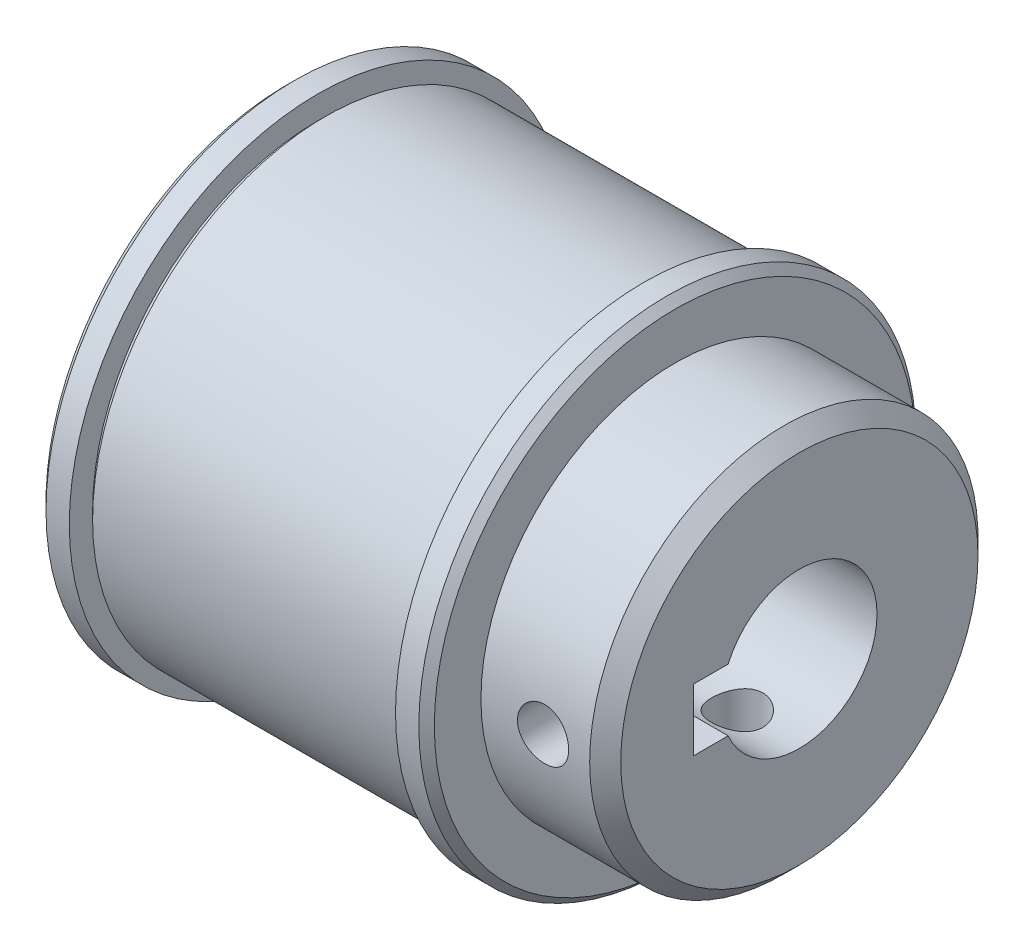
ISO-10303-21;
HEADER;
FILE_DESCRIPTION(('STEP AP214'),'2;1');
FILE_NAME('part.step','',(''),(''),'','','');
FILE_SCHEMA(('AUTOMOTIVE_DESIGN { 1 0 10303 214 1 1 1 1 }'));
ENDSEC;
DATA;
#1=APPLICATION_CONTEXT('core data for automotive mechanical design processes');
#2=APPLICATION_PROTOCOL_DEFINITION('international standard','automotive_design',2000,#1);
#3=PRODUCT_CONTEXT('',#1,'mechanical');
#4=PRODUCT('Part','Part','',(#3));
#5=PRODUCT_RELATED_PRODUCT_CATEGORY('part','',(#4));
#6=PRODUCT_DEFINITION_FORMATION('','',#4);
#7=PRODUCT_DEFINITION_CONTEXT('part definition',#1,'design');
#8=PRODUCT_DEFINITION('design','',#6,#7);
#9=PRODUCT_DEFINITION_SHAPE('','',#8);
#10=(LENGTH_UNIT() NAMED_UNIT(*) SI_UNIT(.MILLI.,.METRE.));
#11=(NAMED_UNIT(*) PLANE_ANGLE_UNIT() SI_UNIT($,.RADIAN.));
#12=(NAMED_UNIT(*) SI_UNIT($,.STERADIAN.) SOLID_ANGLE_UNIT());
#13=UNCERTAINTY_MEASURE_WITH_UNIT(LENGTH_MEASURE(1.E-05),#10,'distance_accuracy_value','');
#14=(GEOMETRIC_REPRESENTATION_CONTEXT(3) GLOBAL_UNCERTAINTY_ASSIGNED_CONTEXT((#13)) GLOBAL_UNIT_ASSIGNED_CONTEXT((#10,
#11,#12)) REPRESENTATION_CONTEXT('',''));
#15=CARTESIAN_POINT('',(0.,0.,0.));
#16=DIRECTION('',(0.,0.,1.));
#17=DIRECTION('',(1.,0.,0.));
#18=AXIS2_PLACEMENT_3D('',#15,#16,#17);
#19=CARTESIAN_POINT('',(0.,0.,0.));
#20=DIRECTION('',(1.,0.,0.));
#21=DIRECTION('',(0.,0.,-1.));
#22=AXIS2_PLACEMENT_3D('',#19,#20,#21);
#23=PLANE('',#22);
#24=CARTESIAN_POINT('',(0.,0.,0.));
#25=DIRECTION('',(1.,0.,0.));
#26=DIRECTION('',(0.,0.,-1.));
#27=AXIS2_PLACEMENT_3D('',#24,#25,#26);
#28=CIRCLE('',#27,15.5);
#29=CARTESIAN_POINT('',(0.,0.,-15.5));
#30=VERTEX_POINT('',#29);
#31=EDGE_CURVE('E134',#30,#30,#28,.F.);
#32=ORIENTED_EDGE('',*,*,#31,.T.);
#33=EDGE_LOOP('',(#32));
#34=FACE_BOUND('',#33,.T.);
#35=CARTESIAN_POINT('',(0.,0.,0.));
#36=DIRECTION('',(-1.,0.,0.));
#37=DIRECTION('',(0.,0.,1.));
#38=AXIS2_PLACEMENT_3D('',#35,#36,#37);
#39=CIRCLE('',#38,5.);
#40=CARTESIAN_POINT('',(0.,2.,4.58257569495584));
#41=VERTEX_POINT('',#40);
#42=CARTESIAN_POINT('',(0.,-2.,4.58257569495584));
#43=VERTEX_POINT('',#42);
#44=EDGE_CURVE('E90',#41,#43,#39,.T.);
#45=ORIENTED_EDGE('',*,*,#44,.F.);
#46=DIRECTION('',(0.,0.,1.));
#47=VECTOR('',#46,1.);
#48=CARTESIAN_POINT('',(0.,2.,6.8));
#49=LINE('',#48,#47);
#50=CARTESIAN_POINT('',(0.,2.,6.8));
#51=VERTEX_POINT('',#50);
#52=EDGE_CURVE('E92',#41,#51,#49,.T.);
#53=ORIENTED_EDGE('',*,*,#52,.T.);
#54=DIRECTION('',(0.,-1.,0.));
#55=VECTOR('',#54,1.);
#56=CARTESIAN_POINT('',(0.,2.,6.8));
#57=LINE('',#56,#55);
#58=CARTESIAN_POINT('',(0.,-2.,6.8));
#59=VERTEX_POINT('',#58);
#60=EDGE_CURVE('E91',#51,#59,#57,.T.);
#61=ORIENTED_EDGE('',*,*,#60,.T.);
#62=DIRECTION('',(0.,0.,-1.));
#63=VECTOR('',#62,1.);
#64=CARTESIAN_POINT('',(0.,-2.,6.8));
#65=LINE('',#64,#63);
#66=EDGE_CURVE('E79',#59,#43,#65,.T.);
#67=ORIENTED_EDGE('',*,*,#66,.T.);
#68=EDGE_LOOP('',(#45,#53,#61,#67));
#69=FACE_BOUND('',#68,.T.);
#70=ADVANCED_FACE('F34',(#34,#69),#23,.F.);
#71=CARTESIAN_POINT('',(33.,12.5,0.));
#72=DIRECTION('',(-1.,0.,0.));
#73=DIRECTION('',(0.,0.,1.));
#74=AXIS2_PLACEMENT_3D('',#71,#72,#73);
#75=PLANE('',#74);
#76=CARTESIAN_POINT('',(33.,0.,0.));
#77=DIRECTION('',(-1.,0.,0.));
#78=DIRECTION('',(0.,0.,1.));
#79=AXIS2_PLACEMENT_3D('',#76,#77,#78);
#80=CIRCLE('',#79,11.5);
#81=CARTESIAN_POINT('',(33.,0.,11.5));
#82=VERTEX_POINT('',#81);
#83=EDGE_CURVE('E131',#82,#82,#80,.F.);
#84=ORIENTED_EDGE('',*,*,#83,.T.);
#85=EDGE_LOOP('',(#84));
#86=FACE_BOUND('',#85,.T.);
#87=DIRECTION('',(0.,-1.,0.));
#88=VECTOR('',#87,1.);
#89=CARTESIAN_POINT('',(33.,2.,6.8));
#90=LINE('',#89,#88);
#91=CARTESIAN_POINT('',(33.,2.,6.8));
#92=VERTEX_POINT('',#91);
#93=CARTESIAN_POINT('',(33.,-2.,6.8));
#94=VERTEX_POINT('',#93);
#95=EDGE_CURVE('E346',#92,#94,#90,.T.);
#96=ORIENTED_EDGE('',*,*,#95,.F.);
#97=DIRECTION('',(0.,0.,1.));
#98=VECTOR('',#97,1.);
#99=CARTESIAN_POINT('',(33.,2.,6.8));
#100=LINE('',#99,#98);
#101=CARTESIAN_POINT('',(33.,2.,4.58257569495584));
#102=VERTEX_POINT('',#101);
#103=EDGE_CURVE('E349',#102,#92,#100,.T.);
#104=ORIENTED_EDGE('',*,*,#103,.F.);
#105=CARTESIAN_POINT('',(33.,0.,0.));
#106=DIRECTION('',(-1.,0.,0.));
#107=DIRECTION('',(0.,0.,1.));
#108=AXIS2_PLACEMENT_3D('',#105,#106,#107);
#109=CIRCLE('',#108,5.);
#110=CARTESIAN_POINT('',(33.,-2.,4.58257569495584));
#111=VERTEX_POINT('',#110);
#112=EDGE_CURVE('E97',#102,#111,#109,.T.);
#113=ORIENTED_EDGE('',*,*,#112,.T.);
#114=DIRECTION('',(0.,0.,-1.));
#115=VECTOR('',#114,1.);
#116=CARTESIAN_POINT('',(33.,-2.,6.8));
#117=LINE('',#116,#115);
#118=EDGE_CURVE('E49',#94,#111,#117,.T.);
#119=ORIENTED_EDGE('',*,*,#118,.F.);
#120=EDGE_LOOP('',(#96,#104,#113,#119));
#121=FACE_BOUND('',#120,.T.);
#122=ADVANCED_FACE('F155',(#86,#121),#75,.F.);
#123=CARTESIAN_POINT('',(-28.0531916649474,0.,0.));
#124=DIRECTION('',(-1.,0.,0.));
#125=DIRECTION('',(0.,0.,1.));
#126=AXIS2_PLACEMENT_3D('',#123,#124,#125);
#127=CYLINDRICAL_SURFACE('',#126,16.);
#128=CARTESIAN_POINT('',(0.500000000000014,0.,0.));
#129=DIRECTION('',(1.,0.,0.));
#130=DIRECTION('',(0.,0.,-1.));
#131=AXIS2_PLACEMENT_3D('',#128,#129,#130);
#132=CIRCLE('',#131,16.);
#133=CARTESIAN_POINT('',(0.500000000000014,0.,-16.));
#134=VERTEX_POINT('',#133);
#135=EDGE_CURVE('E137',#134,#134,#132,.T.);
#136=ORIENTED_EDGE('',*,*,#135,.T.);
#137=EDGE_LOOP('',(#136));
#138=FACE_BOUND('',#137,.T.);
#139=CARTESIAN_POINT('',(2.,0.,0.));
#140=DIRECTION('',(-1.,0.,0.));
#141=DIRECTION('',(0.,0.,1.));
#142=AXIS2_PLACEMENT_3D('',#139,#140,#141);
#143=CIRCLE('',#142,16.);
#144=CARTESIAN_POINT('',(2.,0.,16.));
#145=VERTEX_POINT('',#144);
#146=EDGE_CURVE('E125',#145,#145,#143,.T.);
#147=ORIENTED_EDGE('',*,*,#146,.T.);
#148=EDGE_LOOP('',(#147));
#149=FACE_BOUND('',#148,.T.);
#150=ADVANCED_FACE('F161',(#138,#149),#127,.T.);
#151=CARTESIAN_POINT('',(2.,16.,0.));
#152=DIRECTION('',(-1.,0.,0.));
#153=DIRECTION('',(0.,0.,1.));
#154=AXIS2_PLACEMENT_3D('',#151,#152,#153);
#155=PLANE('',#154);
#156=ORIENTED_EDGE('',*,*,#146,.F.);
#157=EDGE_LOOP('',(#156));
#158=FACE_BOUND('',#157,.T.);
#159=CARTESIAN_POINT('',(2.,0.,0.));
#160=DIRECTION('',(-1.,0.,0.));
#161=DIRECTION('',(0.,0.,1.));
#162=AXIS2_PLACEMENT_3D('',#159,#160,#161);
#163=CIRCLE('',#162,14.5);
#164=CARTESIAN_POINT('',(2.,0.,14.5));
#165=VERTEX_POINT('',#164);
#166=EDGE_CURVE('E122',#165,#165,#163,.T.);
#167=ORIENTED_EDGE('',*,*,#166,.T.);
#168=EDGE_LOOP('',(#167));
#169=FACE_BOUND('',#168,.T.);
#170=ADVANCED_FACE('F226',(#158,#169),#155,.F.);
#171=CARTESIAN_POINT('',(-28.0531916649474,0.,0.));
#172=DIRECTION('',(-1.,0.,0.));
#173=DIRECTION('',(0.,0.,1.));
#174=AXIS2_PLACEMENT_3D('',#171,#172,#173);
#175=CYLINDRICAL_SURFACE('',#174,14.5);
#176=ORIENTED_EDGE('',*,*,#166,.F.);
#177=EDGE_LOOP('',(#176));
#178=FACE_BOUND('',#177,.T.);
#179=CARTESIAN_POINT('',(2.5,0.,0.));
#180=DIRECTION('',(-1.,0.,0.));
#181=DIRECTION('',(0.,0.,1.));
#182=AXIS2_PLACEMENT_3D('',#179,#180,#181);
#183=CIRCLE('',#182,14.5);
#184=CARTESIAN_POINT('',(2.5,0.,14.5));
#185=VERTEX_POINT('',#184);
#186=EDGE_CURVE('E119',#185,#185,#183,.T.);
#187=ORIENTED_EDGE('',*,*,#186,.T.);
#188=EDGE_LOOP('',(#187));
#189=FACE_BOUND('',#188,.T.);
#190=ADVANCED_FACE('F223',(#178,#189),#175,.T.);
#191=CARTESIAN_POINT('',(2.5,14.5,0.));
#192=DIRECTION('',(1.,0.,0.));
#193=DIRECTION('',(0.,0.,-1.));
#194=AXIS2_PLACEMENT_3D('',#191,#192,#193);
#195=PLANE('',#194);
#196=ORIENTED_EDGE('',*,*,#186,.F.);
#197=EDGE_LOOP('',(#196));
#198=FACE_BOUND('',#197,.T.);
#199=CARTESIAN_POINT('',(2.5,0.,0.));
#200=DIRECTION('',(-1.,0.,0.));
#201=DIRECTION('',(0.,0.,1.));
#202=AXIS2_PLACEMENT_3D('',#199,#200,#201);
#203=CIRCLE('',#202,15.);
#204=CARTESIAN_POINT('',(2.5,0.,15.));
#205=VERTEX_POINT('',#204);
#206=EDGE_CURVE('E116',#205,#205,#203,.T.);
#207=ORIENTED_EDGE('',*,*,#206,.T.);
#208=EDGE_LOOP('',(#207));
#209=FACE_BOUND('',#208,.T.);
#210=ADVANCED_FACE('F219',(#198,#209),#195,.F.);
#211=CARTESIAN_POINT('',(-28.0531916649474,0.,0.));
#212=DIRECTION('',(-1.,0.,0.));
#213=DIRECTION('',(0.,0.,1.));
#214=AXIS2_PLACEMENT_3D('',#211,#212,#213);
#215=CYLINDRICAL_SURFACE('',#214,15.);
#216=ORIENTED_EDGE('',*,*,#206,.F.);
#217=EDGE_LOOP('',(#216));
#218=FACE_BOUND('',#217,.T.);
#219=CARTESIAN_POINT('',(22.5,0.,0.));
#220=DIRECTION('',(-1.,0.,0.));
#221=DIRECTION('',(0.,0.,1.));
#222=AXIS2_PLACEMENT_3D('',#219,#220,#221);
#223=CIRCLE('',#222,15.);
#224=CARTESIAN_POINT('',(22.5,0.,15.));
#225=VERTEX_POINT('',#224);
#226=EDGE_CURVE('E113',#225,#225,#223,.T.);
#227=ORIENTED_EDGE('',*,*,#226,.T.);
#228=EDGE_LOOP('',(#227));
#229=FACE_BOUND('',#228,.T.);
#230=ADVANCED_FACE('F215',(#218,#229),#215,.T.);
#231=CARTESIAN_POINT('',(22.5,15.,0.));
#232=DIRECTION('',(-1.,0.,0.));
#233=DIRECTION('',(0.,0.,1.));
#234=AXIS2_PLACEMENT_3D('',#231,#232,#233);
#235=PLANE('',#234);
#236=ORIENTED_EDGE('',*,*,#226,.F.);
#237=EDGE_LOOP('',(#236));
#238=FACE_BOUND('',#237,.T.);
#239=CARTESIAN_POINT('',(22.5,0.,0.));
#240=DIRECTION('',(-1.,0.,0.));
#241=DIRECTION('',(0.,0.,1.));
#242=AXIS2_PLACEMENT_3D('',#239,#240,#241);
#243=CIRCLE('',#242,14.5);
#244=CARTESIAN_POINT('',(22.5,0.,14.5));
#245=VERTEX_POINT('',#244);
#246=EDGE_CURVE('E110',#245,#245,#243,.T.);
#247=ORIENTED_EDGE('',*,*,#246,.T.);
#248=EDGE_LOOP('',(#247));
#249=FACE_BOUND('',#248,.T.);
#250=ADVANCED_FACE('F211',(#238,#249),#235,.F.);
#251=CARTESIAN_POINT('',(-28.0531916649474,0.,0.));
#252=DIRECTION('',(-1.,0.,0.));
#253=DIRECTION('',(0.,0.,1.));
#254=AXIS2_PLACEMENT_3D('',#251,#252,#253);
#255=CYLINDRICAL_SURFACE('',#254,14.5);
#256=ORIENTED_EDGE('',*,*,#246,.F.);
#257=EDGE_LOOP('',(#256));
#258=FACE_BOUND('',#257,.T.);
#259=CARTESIAN_POINT('',(23.,0.,0.));
#260=DIRECTION('',(-1.,0.,0.));
#261=DIRECTION('',(0.,0.,1.));
#262=AXIS2_PLACEMENT_3D('',#259,#260,#261);
#263=CIRCLE('',#262,14.5);
#264=CARTESIAN_POINT('',(23.,0.,14.5));
#265=VERTEX_POINT('',#264);
#266=EDGE_CURVE('E107',#265,#265,#263,.T.);
#267=ORIENTED_EDGE('',*,*,#266,.T.);
#268=EDGE_LOOP('',(#267));
#269=FACE_BOUND('',#268,.T.);
#270=ADVANCED_FACE('F207',(#258,#269),#255,.T.);
#271=CARTESIAN_POINT('',(23.,14.5,0.));
#272=DIRECTION('',(1.,0.,0.));
#273=DIRECTION('',(0.,0.,-1.));
#274=AXIS2_PLACEMENT_3D('',#271,#272,#273);
#275=PLANE('',#274);
#276=ORIENTED_EDGE('',*,*,#266,.F.);
#277=EDGE_LOOP('',(#276));
#278=FACE_BOUND('',#277,.T.);
#279=CARTESIAN_POINT('',(23.,0.,0.));
#280=DIRECTION('',(-1.,0.,0.));
#281=DIRECTION('',(0.,0.,1.));
#282=AXIS2_PLACEMENT_3D('',#279,#280,#281);
#283=CIRCLE('',#282,16.);
#284=CARTESIAN_POINT('',(23.,0.,16.));
#285=VERTEX_POINT('',#284);
#286=EDGE_CURVE('E100',#285,#285,#283,.T.);
#287=ORIENTED_EDGE('',*,*,#286,.T.);
#288=EDGE_LOOP('',(#287));
#289=FACE_BOUND('',#288,.T.);
#290=ADVANCED_FACE('F201',(#278,#289),#275,.F.);
#291=CARTESIAN_POINT('',(-28.0531916649474,0.,0.));
#292=DIRECTION('',(-1.,0.,0.));
#293=DIRECTION('',(0.,0.,1.));
#294=AXIS2_PLACEMENT_3D('',#291,#292,#293);
#295=CYLINDRICAL_SURFACE('',#294,16.);
#296=CARTESIAN_POINT('',(24.5,0.,0.));
#297=DIRECTION('',(-1.,0.,0.));
#298=DIRECTION('',(0.,0.,1.));
#299=AXIS2_PLACEMENT_3D('',#296,#297,#298);
#300=CIRCLE('',#299,16.);
#301=CARTESIAN_POINT('',(24.5,0.,16.));
#302=VERTEX_POINT('',#301);
#303=EDGE_CURVE('E42',#302,#302,#300,.T.);
#304=ORIENTED_EDGE('',*,*,#303,.T.);
#305=EDGE_LOOP('',(#304));
#306=FACE_BOUND('',#305,.T.);
#307=ORIENTED_EDGE('',*,*,#286,.F.);
#308=EDGE_LOOP('',(#307));
#309=FACE_BOUND('',#308,.T.);
#310=ADVANCED_FACE('F142',(#306,#309),#295,.T.);
#311=CARTESIAN_POINT('',(25.,16.,0.));
#312=DIRECTION('',(-1.,0.,0.));
#313=DIRECTION('',(0.,0.,1.));
#314=AXIS2_PLACEMENT_3D('',#311,#312,#313);
#315=PLANE('',#314);
#316=CARTESIAN_POINT('',(25.,0.,0.));
#317=DIRECTION('',(-1.,0.,0.));
#318=DIRECTION('',(0.,0.,1.));
#319=AXIS2_PLACEMENT_3D('',#316,#317,#318);
#320=CIRCLE('',#319,15.5);
#321=CARTESIAN_POINT('',(25.,0.,15.5));
#322=VERTEX_POINT('',#321);
#323=EDGE_CURVE('E11',#322,#322,#320,.F.);
#324=ORIENTED_EDGE('',*,*,#323,.T.);
#325=EDGE_LOOP('',(#324));
#326=FACE_BOUND('',#325,.T.);
#327=CARTESIAN_POINT('',(25.,0.,0.));
#328=DIRECTION('',(-1.,0.,0.));
#329=DIRECTION('',(0.,0.,1.));
#330=AXIS2_PLACEMENT_3D('',#327,#328,#329);
#331=CIRCLE('',#330,12.5);
#332=CARTESIAN_POINT('',(25.,0.,12.5));
#333=VERTEX_POINT('',#332);
#334=EDGE_CURVE('E96',#333,#333,#331,.T.);
#335=ORIENTED_EDGE('',*,*,#334,.T.);
#336=EDGE_LOOP('',(#335));
#337=FACE_BOUND('',#336,.T.);
#338=ADVANCED_FACE('F183',(#326,#337),#315,.F.);
#339=CARTESIAN_POINT('',(-28.0531916649474,0.,0.));
#340=DIRECTION('',(-1.,0.,0.));
#341=DIRECTION('',(0.,0.,1.));
#342=AXIS2_PLACEMENT_3D('',#339,#340,#341);
#343=CYLINDRICAL_SURFACE('',#342,12.5);
#344=CARTESIAN_POINT('',(32.,0.,0.));
#345=DIRECTION('',(-1.,0.,0.));
#346=DIRECTION('',(0.,0.,1.));
#347=AXIS2_PLACEMENT_3D('',#344,#345,#346);
#348=CIRCLE('',#347,12.5);
#349=CARTESIAN_POINT('',(32.,0.,12.5));
#350=VERTEX_POINT('',#349);
#351=EDGE_CURVE('E128',#350,#350,#348,.T.);
#352=ORIENTED_EDGE('',*,*,#351,.T.);
#353=EDGE_LOOP('',(#352));
#354=FACE_BOUND('',#353,.T.);
#355=CARTESIAN_POINT('',(29.,-12.3906214533412,-1.65000000000004));
#356=CARTESIAN_POINT('',(28.9077529812497,-12.390622842409,-1.649996105045));
#357=CARTESIAN_POINT('',(28.8154493802797,-12.3916627387899,-1.64223796098617));
#358=CARTESIAN_POINT('',(28.6334141086789,-12.3957080675848,-1.61141361420505));
#359=CARTESIAN_POINT('',(28.5436851775111,-12.3987155180302,-1.58833169421812));
#360=CARTESIAN_POINT('',(28.369460996792,-12.4063495138996,-1.52755482004118));
#361=CARTESIAN_POINT('',(28.2849621218452,-12.4109749226447,-1.4898701228736));
#362=CARTESIAN_POINT('',(28.1235022707616,-12.4213223048405,-1.40097999603682));
#363=CARTESIAN_POINT('',(28.0465400748445,-12.427044100401,-1.3497767592617));
#364=CARTESIAN_POINT('',(27.9018443149831,-12.4389794327506,-1.23496184347493));
#365=CARTESIAN_POINT('',(27.834164474769,-12.4451955281557,-1.17128271724037));
#366=CARTESIAN_POINT('',(27.7104190790807,-12.4573961026217,-1.03346898669935));
#367=CARTESIAN_POINT('',(27.6543541168985,-12.4633805698383,-0.959333848621169));
#368=CARTESIAN_POINT('',(27.5552356540108,-12.4744699620016,-0.802372955937589));
#369=CARTESIAN_POINT('',(27.5122310205339,-12.4795715536533,-0.7195160868614));
#370=CARTESIAN_POINT('',(27.4407671084767,-12.4882921996643,-0.547677504608558));
#371=CARTESIAN_POINT('',(27.4123072304429,-12.4919113151218,-0.458696044024864));
#372=CARTESIAN_POINT('',(27.3709018936456,-12.4972412029391,-0.277684805755447));
#373=CARTESIAN_POINT('',(27.3578669105885,-12.4989629831594,-0.185675835591742));
#374=CARTESIAN_POINT('',(27.3474037909345,-12.5003418301835,-0.000761418784723982));
#375=CARTESIAN_POINT('',(27.3499749737811,-12.4999989870218,0.0921439885901857));
#376=CARTESIAN_POINT('',(27.3705797419638,-12.4972960932803,0.275604499217168));
#377=CARTESIAN_POINT('',(27.388517038176,-12.4949486047565,0.366170628040474));
#378=CARTESIAN_POINT('',(27.4391941760148,-12.4885142485345,0.542995946055142));
#379=CARTESIAN_POINT('',(27.471934326077,-12.4844273445935,0.629255045462669));
#380=CARTESIAN_POINT('',(27.5513891884528,-12.4749517127752,0.795314074664762));
#381=CARTESIAN_POINT('',(27.5981452723428,-12.4695591400754,0.87509398094523));
#382=CARTESIAN_POINT('',(27.7042746464164,-12.4580748892249,1.02571156023635));
#383=CARTESIAN_POINT('',(27.7636485815178,-12.4519831753473,1.09654877587722));
#384=CARTESIAN_POINT('',(27.8938668042931,-12.4397269723775,1.2278363723053));
#385=CARTESIAN_POINT('',(27.9647950514165,-12.4335622824552,1.28820348917059));
#386=CARTESIAN_POINT('',(28.1158209228234,-12.4219005988811,1.39618935869216));
#387=CARTESIAN_POINT('',(28.1959185821474,-12.4164036077809,1.4438080626286));
#388=CARTESIAN_POINT('',(28.3630870805676,-12.4066998381533,1.52495183360789));
#389=CARTESIAN_POINT('',(28.4501614370551,-12.4024937156614,1.5584697376461));
#390=CARTESIAN_POINT('',(28.6287708299391,-12.3958603785865,1.61038403482917));
#391=CARTESIAN_POINT('',(28.7203056253638,-12.3934330680179,1.62878124390077));
#392=CARTESIAN_POINT('',(28.9045007573919,-12.3906499237645,1.64982062797807));
#393=CARTESIAN_POINT('',(28.9971474594742,-12.3902786546195,1.6525802041081));
#394=CARTESIAN_POINT('',(29.1815818874796,-12.3916087674049,1.64257621411439));
#395=CARTESIAN_POINT('',(29.2733696338259,-12.3933100999289,1.62981301802072));
#396=CARTESIAN_POINT('',(29.4531257049308,-12.3985796103553,1.5892248257292));
#397=CARTESIAN_POINT('',(29.5411071888201,-12.4021406872895,1.56145710665117));
#398=CARTESIAN_POINT('',(29.7111657983892,-12.4107226630909,1.4917072134553));
#399=CARTESIAN_POINT('',(29.7932426940239,-12.4157436187973,1.44972448587789));
#400=CARTESIAN_POINT('',(29.9496921487923,-12.4267164355394,1.35244938903308));
#401=CARTESIAN_POINT('',(30.0240166225416,-12.4326735912836,1.29708029024584));
#402=CARTESIAN_POINT('',(30.1623598422105,-12.4448311479373,1.17471216755438));
#403=CARTESIAN_POINT('',(30.2263781398244,-12.4510315594137,1.10771263800423));
#404=CARTESIAN_POINT('',(30.3427065877358,-12.4630246354699,0.963471564577878));
#405=CARTESIAN_POINT('',(30.3949394190292,-12.4688144456498,0.886167392435773));
#406=CARTESIAN_POINT('',(30.4856782763785,-12.4792908593681,0.723814499676989));
#407=CARTESIAN_POINT('',(30.5241846060057,-12.4839774873033,0.638765950384902));
#408=CARTESIAN_POINT('',(30.5862508055784,-12.4917068572279,0.463591355078367));
#409=CARTESIAN_POINT('',(30.6098547251874,-12.4947544400359,0.373481138803795));
#410=CARTESIAN_POINT('',(30.6415891964807,-12.4988825017265,0.190533421597461));
#411=CARTESIAN_POINT('',(30.6497205304337,-12.4999630800575,0.0976960587867755));
#412=CARTESIAN_POINT('',(30.6502632217664,-12.5000347750092,-0.0873170308661977));
#413=CARTESIAN_POINT('',(30.6427935556321,-12.4990417057128,-0.179492425089107));
#414=CARTESIAN_POINT('',(30.61259906513,-12.49510923237,-0.361265269899169));
#415=CARTESIAN_POINT('',(30.5898742602823,-12.4921698308141,-0.450862723784823));
#416=CARTESIAN_POINT('',(30.5298532371033,-12.4846734375501,-0.624916223361518));
#417=CARTESIAN_POINT('',(30.4925633944418,-12.4801171536923,-0.709374499994535));
#418=CARTESIAN_POINT('',(30.4044831880862,-12.4698904395954,-0.870853679316645));
#419=CARTESIAN_POINT('',(30.3536925895857,-12.4642199899791,-0.947874452620151));
#420=CARTESIAN_POINT('',(30.2396148986212,-12.4523456579428,-1.0928991073011));
#421=CARTESIAN_POINT('',(30.176239419232,-12.4461381886584,-1.16083317380399));
#422=CARTESIAN_POINT('',(30.0389756580012,-12.433917636119,-1.28514764411076));
#423=CARTESIAN_POINT('',(29.9650848972383,-12.4279045991117,-1.34152531588646));
#424=CARTESIAN_POINT('',(29.8085200296021,-12.4167260958792,-1.44133755284509));
#425=CARTESIAN_POINT('',(29.7258094694616,-12.411564391032,-1.48471533599362));
#426=CARTESIAN_POINT('',(29.5542536842561,-12.4027170148827,-1.55690238360373));
#427=CARTESIAN_POINT('',(29.4654151690585,-12.3990297582797,-1.58572730385412));
#428=CARTESIAN_POINT('',(29.313443337075,-12.3944327967712,-1.62118273007375));
#429=CARTESIAN_POINT('',(29.2512637869407,-12.3930107795575,-1.63197341052259));
#430=CARTESIAN_POINT('',(29.1260649626882,-12.3911046373194,-1.64638334472929));
#431=CARTESIAN_POINT('',(29.0630456960102,-12.3906205039908,-1.65000266198472));
#432=CARTESIAN_POINT('',(29.,-12.3906214533412,-1.65000000000004));
#433=B_SPLINE_CURVE_WITH_KNOTS('',3,(#355,#356,#357,#358,#359,#360,#361,#362,#363,#364,#365,
#366,#367,#368,#369,#370,#371,#372,#373,#374,#375,#376,#377,#378,#379,#380,#381,#382,#383,#384,
#385,#386,#387,#388,#389,#390,#391,#392,#393,#394,#395,#396,#397,#398,#399,#400,#401,#402,#403,
#404,#405,#406,#407,#408,#409,#410,#411,#412,#413,#414,#415,#416,#417,#418,#419,#420,#421,#422,
#423,#424,#425,#426,#427,#428,#429,#430,#431,#432),.UNSPECIFIED.,.T.,.F.,(4,2,2,2,2,2,2,2,2,2,2,
2,2,2,2,2,2,2,2,2,2,2,2,2,2,2,2,2,2,2,2,2,2,2,2,2,2,2,4),(0.,0.27651070920496,0.553305468522169,
0.829906157991492,1.10646200654206,1.38455642039672,1.66266503590881,1.94180176864111,
2.22092699598994,2.49842414100944,2.77590918496772,3.05166803008656,3.32743262124437,
3.60401935364639,3.88062022622308,4.1593288727097,4.43803858430549,4.71688970598858,
4.99572577961808,5.2724656610244,5.54919894566643,5.82488323653088,6.10057826236313,
6.37789266165134,6.65521912051287,6.93431525868805,7.21340522407235,7.49166632376143,
7.76991335464931,8.04604616606945,8.32217862415914,8.59819034381358,8.87420686420634,
9.15223523288005,9.43032925416772,9.70962082458509,9.98861129294449,10.1775926249163,
10.3665722835791),.UNSPECIFIED.);
#434=CARTESIAN_POINT('',(29.,-12.3906214533412,-1.65000000000004));
#435=VERTEX_POINT('',#434);
#436=EDGE_CURVE('E188',#435,#435,#433,.T.);
#437=ORIENTED_EDGE('',*,*,#436,.T.);
#438=EDGE_LOOP('',(#437));
#439=FACE_BOUND('',#438,.T.);
#440=CARTESIAN_POINT('',(30.65,0.,12.5));
#441=CARTESIAN_POINT('',(30.649996108493,-0.0922509659142322,12.4999986553884));
#442=CARTESIAN_POINT('',(30.6422373229056,-0.184558502715377,12.498968007311));
#443=CARTESIAN_POINT('',(30.6114101965439,-0.366601950920956,12.4949556982822));
#444=CARTESIAN_POINT('',(30.5883261525009,-0.456335125975899,12.4919720361882));
#445=CARTESIAN_POINT('',(30.5275430658043,-0.630568283941341,12.4843896079466));
#446=CARTESIAN_POINT('',(30.4898541795178,-0.715071856319479,12.4797919643879));
#447=CARTESIAN_POINT('',(30.4009541850337,-0.876539590939072,12.4694920533569));
#448=CARTESIAN_POINT('',(30.3497452798764,-0.953504978702874,12.4637899658902));
#449=CARTESIAN_POINT('',(30.2349246162499,-1.09819718658205,12.4518781663594));
#450=CARTESIAN_POINT('',(30.1712466789113,-1.16587128164739,12.4456658531834));
#451=CARTESIAN_POINT('',(30.0334377453889,-1.28960557413888,12.4334545778039));
#452=CARTESIAN_POINT('',(29.9593061996809,-1.34566516063207,12.4274556268374));
#453=CARTESIAN_POINT('',(29.8023485063494,-1.44477796066645,12.4163248280925));
#454=CARTESIAN_POINT('',(29.7194906262257,-1.48778133107336,12.4111963353939));
#455=CARTESIAN_POINT('',(29.5476498481938,-1.55924262980493,12.4024218004722));
#456=CARTESIAN_POINT('',(29.4586672090305,-1.58770117215908,12.3987756956693));
#457=CARTESIAN_POINT('',(29.2776521510902,-1.62910377910463,12.3934038347284));
#458=CARTESIAN_POINT('',(29.1856405112843,-1.64213723047392,12.3916670186782));
#459=CARTESIAN_POINT('',(29.0007208517276,-1.6525963615546,12.3902766213381));
#460=CARTESIAN_POINT('',(28.9078128722266,-1.65002273886783,12.3906229469364));
#461=CARTESIAN_POINT('',(28.7243630091398,-1.62941406600359,12.3933495814873));
#462=CARTESIAN_POINT('',(28.6338098117739,-1.61147776254764,12.395716899785));
#463=CARTESIAN_POINT('',(28.4570098424832,-1.56080707632498,12.4021985149079));
#464=CARTESIAN_POINT('',(28.3707631670048,-1.52807236230628,12.4063128508388));
#465=CARTESIAN_POINT('',(28.2047193602968,-1.44862884068035,12.4158395520745));
#466=CARTESIAN_POINT('',(28.1249428591672,-1.40187740731701,12.4212558666767));
#467=CARTESIAN_POINT('',(27.9743301263229,-1.29575800474392,12.4327732471151));
#468=CARTESIAN_POINT('',(27.903494350599,-1.23638939245273,12.4388743478466));
#469=CARTESIAN_POINT('',(27.7722008987607,-1.1061749979815,12.4511315214541));
#470=CARTESIAN_POINT('',(27.711827556525,-1.03524415653744,12.4572876551224));
#471=CARTESIAN_POINT('',(27.6038303550122,-0.884210857811208,12.4689172796715));
#472=CARTESIAN_POINT('',(27.5562065311987,-0.804108375018413,12.4743907686536));
#473=CARTESIAN_POINT('',(27.4750590553997,-0.63693846098638,12.484042355461));
#474=CARTESIAN_POINT('',(27.4415410048673,-0.549868279152671,12.4882199385046));
#475=CARTESIAN_POINT('',(27.3896251404349,-0.371267976474136,12.4948044580827));
#476=CARTESIAN_POINT('',(27.3712265366073,-0.27973808889488,12.4972114871206));
#477=CARTESIAN_POINT('',(27.3501818803089,-0.095545411060567,12.4999716099048));
#478=CARTESIAN_POINT('',(27.347419715491,-0.0028961051185729,12.5003398427993));
#479=CARTESIAN_POINT('',(27.3574194573787,0.181544148381852,12.4990218465851));
#480=CARTESIAN_POINT('',(27.3701809944688,0.273335116324652,12.4973356663916));
#481=CARTESIAN_POINT('',(27.4107693973755,0.453108088985704,12.4921077115532));
#482=CARTESIAN_POINT('',(27.4385405826276,0.541102881534318,12.4885727966281));
#483=CARTESIAN_POINT('',(27.5083018540169,0.711186579168433,12.4800429260914));
#484=CARTESIAN_POINT('',(27.5502924729797,0.793275262802479,12.4750479157687));
#485=CARTESIAN_POINT('',(27.6475793399222,0.949733027407936,12.4641165128389));
#486=CARTESIAN_POINT('',(27.7029503167502,1.02405527014396,12.4581748993319));
#487=CARTESIAN_POINT('',(27.8253208444056,1.16239311646148,12.4460304374708));
#488=CARTESIAN_POINT('',(27.8923209121987,1.22640826160187,12.4398275775125));
#489=CARTESIAN_POINT('',(28.0365606693967,1.34272949930146,12.427812668937));
#490=CARTESIAN_POINT('',(28.1138628794239,1.39495839046206,12.422003362126));
#491=CARTESIAN_POINT('',(28.2762107591961,1.48569034045957,12.4114793355964));
#492=CARTESIAN_POINT('',(28.3612562588334,1.52419370073336,12.40676459184));
#493=CARTESIAN_POINT('',(28.5364324575978,1.5862580202103,12.3989825257156));
#494=CARTESIAN_POINT('',(28.6265477874228,1.60986174308101,12.395910492496));
#495=CARTESIAN_POINT('',(28.8095063214484,1.64159408961648,12.3917484325846));
#496=CARTESIAN_POINT('',(28.9023493826185,1.64972352322194,12.390658302158));
#497=CARTESIAN_POINT('',(29.0873595185922,1.65026050729394,12.3905867313463));
#498=CARTESIAN_POINT('',(29.179526258381,1.64278936343219,12.3915890208826));
#499=CARTESIAN_POINT('',(29.3612814162313,1.61259495475241,12.3955542787341));
#500=CARTESIAN_POINT('',(29.4508698350461,1.58987169439037,12.3985172464765));
#501=CARTESIAN_POINT('',(29.6249046327979,1.52985734760343,12.4060648042427));
#502=CARTESIAN_POINT('',(29.7093533017143,1.4925728045936,12.4106486657967));
#503=CARTESIAN_POINT('',(29.8708154653852,1.40450618423475,12.4209226365687));
#504=CARTESIAN_POINT('',(29.9478288247782,1.35372386121887,12.4266127659209));
#505=CARTESIAN_POINT('',(30.0928534458449,1.23965546715594,12.4385110765891));
#506=CARTESIAN_POINT('',(30.1607934040608,1.17627910409951,12.4447228000133));
#507=CARTESIAN_POINT('',(30.2851193500531,1.03901112502639,12.4569335544568));
#508=CARTESIAN_POINT('',(30.3415026214902,0.965117043774374,12.4629325351987));
#509=CARTESIAN_POINT('',(30.4413211149838,0.808549280168608,12.4740702486112));
#510=CARTESIAN_POINT('',(30.4847005022019,0.725839748433101,12.4792052313115));
#511=CARTESIAN_POINT('',(30.5568908306887,0.554286102127637,12.4879988146703));
#512=CARTESIAN_POINT('',(30.58571740896,0.465448689177241,12.4916589991428));
#513=CARTESIAN_POINT('',(30.6211773438647,0.313472456145786,12.4962204250721));
#514=CARTESIAN_POINT('',(30.6319700524388,0.251287086879959,12.4976307637456));
#515=CARTESIAN_POINT('',(30.6463826796329,0.126076615825897,12.4995210067266));
#516=CARTESIAN_POINT('',(30.6500026597601,0.06305152124309,12.5000009190127));
#517=CARTESIAN_POINT('',(30.65,0.,12.5));
#518=B_SPLINE_CURVE_WITH_KNOTS('',3,(#440,#441,#442,#443,#444,#445,#446,#447,#448,#449,#450,
#451,#452,#453,#454,#455,#456,#457,#458,#459,#460,#461,#462,#463,#464,#465,#466,#467,#468,#469,
#470,#471,#472,#473,#474,#475,#476,#477,#478,#479,#480,#481,#482,#483,#484,#485,#486,#487,#488,
#489,#490,#491,#492,#493,#494,#495,#496,#497,#498,#499,#500,#501,#502,#503,#504,#505,#506,#507,
#508,#509,#510,#511,#512,#513,#514,#515,#516,#517),.UNSPECIFIED.,.T.,.F.,(4,2,2,2,2,2,2,2,2,2,2,
2,2,2,2,2,2,2,2,2,2,2,2,2,2,2,2,2,2,2,2,2,2,2,2,2,2,2,4),(0.,0.27652256759341,0.553328916636195,
0.829943115961213,1.106512269752,1.38459116209452,1.66268467791007,1.94182686179847,
2.22095726035025,2.49846208170458,2.77595449929573,3.05167655007194,3.32740477299743,
3.60398015842831,3.88056964393412,4.15929423753898,4.43801960642625,4.71685555395556,
4.99567693255303,5.27242510869487,5.54916669566328,5.8248886443913,6.1006209260206,
6.37793027840443,6.6552519616027,6.93434056471001,7.21342303816139,7.49170082672564,
7.7699640495348,8.04607163604134,8.32217914188146,8.59816271557353,8.87415131265897,
9.15219502941569,9.43030402415314,9.70959057438997,9.98857638890448,10.1775751477028,
10.3665722858035),.UNSPECIFIED.);
#519=CARTESIAN_POINT('',(30.65,0.,12.5));
#520=VERTEX_POINT('',#519);
#521=EDGE_CURVE('E192',#520,#520,#518,.T.);
#522=ORIENTED_EDGE('',*,*,#521,.T.);
#523=EDGE_LOOP('',(#522));
#524=FACE_BOUND('',#523,.T.);
#525=ORIENTED_EDGE('',*,*,#334,.F.);
#526=EDGE_LOOP('',(#525));
#527=FACE_BOUND('',#526,.T.);
#528=ADVANCED_FACE('F180',(#354,#439,#524,#527),#343,.T.);
#529=CARTESIAN_POINT('',(-6.49181897256035,0.,0.));
#530=DIRECTION('',(-1.,0.,0.));
#531=DIRECTION('',(0.,0.,1.));
#532=AXIS2_PLACEMENT_3D('',#529,#530,#531);
#533=CYLINDRICAL_SURFACE('',#532,5.);
#534=CARTESIAN_POINT('',(29.,-4.71990466005404,-1.65000000000004));
#535=CARTESIAN_POINT('',(28.9100706007094,-4.71990452115881,-1.65000024360507));
#536=CARTESIAN_POINT('',(28.8201423135003,-4.72250292266517,-1.64262303818659));
#537=CARTESIAN_POINT('',(28.6429463265648,-4.73256311651637,-1.61340616817488));
#538=CARTESIAN_POINT('',(28.5556791125396,-4.74002579119601,-1.59156387973593));
#539=CARTESIAN_POINT('',(28.3864003006209,-4.75887919770345,-1.53426465819812));
#540=CARTESIAN_POINT('',(28.3043789223365,-4.77026235105613,-1.49883397722411));
#541=CARTESIAN_POINT('',(28.1474185036429,-4.79566317693292,-1.41545303535859));
#542=CARTESIAN_POINT('',(28.0724809815363,-4.80968141232601,-1.3675000987865));
#543=CARTESIAN_POINT('',(27.9289423606118,-4.83937566103106,-1.25846654308769));
#544=CARTESIAN_POINT('',(27.8606525142665,-4.85509238793418,-1.19698715979914));
#545=CARTESIAN_POINT('',(27.7351407323211,-4.8860682262247,-1.06349727663176));
#546=CARTESIAN_POINT('',(27.677920534534,-4.90132726544298,-0.991485126335518));
#547=CARTESIAN_POINT('',(27.5747664109772,-4.93013890958223,-0.836704215602442));
#548=CARTESIAN_POINT('',(27.5291576935933,-4.94363804307573,-0.753707887278405));
#549=CARTESIAN_POINT('',(27.4526712651502,-4.96692987406679,-0.580699685040927));
#550=CARTESIAN_POINT('',(27.4217896679435,-4.97672354920831,-0.490689669179546));
#551=CARTESIAN_POINT('',(27.3766869281249,-4.99121262924257,-0.3094718310711));
#552=CARTESIAN_POINT('',(27.3619327850115,-4.99607073696453,-0.218409916306887));
#553=CARTESIAN_POINT('',(27.3478100012852,-5.00071837425094,-0.0349820134684582));
#554=CARTESIAN_POINT('',(27.3484374721539,-5.00050918484354,0.0573836391159053));
#555=CARTESIAN_POINT('',(27.3647199745432,-4.99515654976729,0.237027933093882));
#556=CARTESIAN_POINT('',(27.3797962649372,-4.99020313675409,0.324365615952646));
#557=CARTESIAN_POINT('',(27.4235926031857,-4.97615641573891,0.495193577668968));
#558=CARTESIAN_POINT('',(27.4523135708243,-4.9670628286506,0.57868359674024));
#559=CARTESIAN_POINT('',(27.5229273780642,-4.94551338736032,0.74072310469302));
#560=CARTESIAN_POINT('',(27.5649866842574,-4.93301533884175,0.819194207586553));
#561=CARTESIAN_POINT('',(27.6609466750387,-4.90596050876769,0.968137400016336));
#562=CARTESIAN_POINT('',(27.7148506057233,-4.89140316323877,1.03860728872213));
#563=CARTESIAN_POINT('',(27.8358951764672,-4.8609729453688,1.17299175258726));
#564=CARTESIAN_POINT('',(27.9035323057344,-4.84507036749808,1.23645304594364));
#565=CARTESIAN_POINT('',(28.0486265896356,-4.81431124792124,1.35127700383057));
#566=CARTESIAN_POINT('',(28.1260851930412,-4.79945486104328,1.40263788022025));
#567=CARTESIAN_POINT('',(28.2900343988576,-4.77230967313124,1.49241382326103));
#568=CARTESIAN_POINT('',(28.3766343876614,-4.76005891661916,1.53064150543125));
#569=CARTESIAN_POINT('',(28.5555476071575,-4.73995346804784,1.59181981773759));
#570=CARTESIAN_POINT('',(28.6478584834583,-4.73209697762929,1.61477669819901));
#571=CARTESIAN_POINT('',(28.8311901676993,-4.72207527963099,1.64384682592316));
#572=CARTESIAN_POINT('',(28.9220868443492,-4.71967327795616,1.65066145601705));
#573=CARTESIAN_POINT('',(29.1037378478879,-4.72017136658522,1.64923749492082));
#574=CARTESIAN_POINT('',(29.1944921971292,-4.72307051828916,1.64100156851913));
#575=CARTESIAN_POINT('',(29.3701200722367,-4.73360855675226,1.6103399712377));
#576=CARTESIAN_POINT('',(29.4550887693968,-4.74108573426461,1.58839792719586));
#577=CARTESIAN_POINT('',(29.6201226070167,-4.75976051805484,1.53152522846692));
#578=CARTESIAN_POINT('',(29.7001868863261,-4.77095877549976,1.49659230032417));
#579=CARTESIAN_POINT('',(29.8559100270408,-4.79624726899173,1.4134884256475));
#580=CARTESIAN_POINT('',(29.9313531690256,-4.81041691149478,1.3649380669865));
#581=CARTESIAN_POINT('',(30.0732756037467,-4.83989585604414,1.25640957990468));
#582=CARTESIAN_POINT('',(30.1397522953269,-4.85520548680904,1.1964281474682));
#583=CARTESIAN_POINT('',(30.2650831807835,-4.88610989384613,1.0633912384203));
#584=CARTESIAN_POINT('',(30.3234322389265,-4.90168425037642,0.989853763923));
#585=CARTESIAN_POINT('',(30.4269926415911,-4.93065204495413,0.833649177353355));
#586=CARTESIAN_POINT('',(30.4722044790524,-4.94404556482344,0.750982407994591));
#587=CARTESIAN_POINT('',(30.5477889922588,-4.96707750850083,0.579295715379748));
#588=CARTESIAN_POINT('',(30.5782604587435,-4.97674084137501,0.490322802958554));
#589=CARTESIAN_POINT('',(30.6236866931923,-4.9913314682593,0.308134735858207));
#590=CARTESIAN_POINT('',(30.6386469384652,-4.99626043401974,0.214921090808555));
#591=CARTESIAN_POINT('',(30.6521408178569,-5.00070328980923,0.0315225864698539));
#592=CARTESIAN_POINT('',(30.6514003120892,-5.00045646732494,-0.0586036580669153));
#593=CARTESIAN_POINT('',(30.6352984757264,-4.99516201889143,-0.237388028290576));
#594=CARTESIAN_POINT('',(30.6199382917103,-4.99011476942583,-0.326046268554034));
#595=CARTESIAN_POINT('',(30.5755116940758,-4.97587240449465,-0.498029665785561));
#596=CARTESIAN_POINT('',(30.5466586650808,-4.96674195827475,-0.581415680377201));
#597=CARTESIAN_POINT('',(30.4762621052186,-4.94527347683186,-0.742196807428964));
#598=CARTESIAN_POINT('',(30.4347162948805,-4.93293486552037,-0.819590840669591));
#599=CARTESIAN_POINT('',(30.3383673460749,-4.9057637494671,-0.969268380933063));
#600=CARTESIAN_POINT('',(30.283135851903,-4.89085668492739,-1.0412624426929));
#601=CARTESIAN_POINT('',(30.1617163493559,-4.86041514438606,-1.1751981855517));
#602=CARTESIAN_POINT('',(30.0955248807022,-4.84488047141096,-1.23713667964083));
#603=CARTESIAN_POINT('',(29.9510441485454,-4.81423121094681,-1.3516017981425));
#604=CARTESIAN_POINT('',(29.8723897305108,-4.79915525016867,-1.40367929286433));
#605=CARTESIAN_POINT('',(29.7069783378758,-4.77186368687928,-1.49383628223882));
#606=CARTESIAN_POINT('',(29.6202236871651,-4.75964726749499,-1.53191977627394));
#607=CARTESIAN_POINT('',(29.4456567275568,-4.74014636717987,-1.59120734764475));
#608=CARTESIAN_POINT('',(29.3581319580648,-4.73263920267758,-1.61318355190481));
#609=CARTESIAN_POINT('',(29.1804038287073,-4.72251921935148,-1.64257737451182));
#610=CARTESIAN_POINT('',(29.0902013549447,-4.71990479936931,-1.64999975565831));
#611=CARTESIAN_POINT('',(29.,-4.71990466005404,-1.65000000000004));
#612=B_SPLINE_CURVE_WITH_KNOTS('',3,(#534,#535,#536,#537,#538,#539,#540,#541,#542,#543,#544,
#545,#546,#547,#548,#549,#550,#551,#552,#553,#554,#555,#556,#557,#558,#559,#560,#561,#562,#563,
#564,#565,#566,#567,#568,#569,#570,#571,#572,#573,#574,#575,#576,#577,#578,#579,#580,#581,#582,
#583,#584,#585,#586,#587,#588,#589,#590,#591,#592,#593,#594,#595,#596,#597,#598,#599,#600,#601,
#602,#603,#604,#605,#606,#607,#608,#609,#610,#611),.UNSPECIFIED.,.T.,.F.,(4,2,2,2,2,2,2,2,2,2,2,
2,2,2,2,2,2,2,2,2,2,2,2,2,2,2,2,2,2,2,2,2,2,2,2,2,2,2,4),(0.,0.269454302916436,
0.538957495994024,0.807942623457629,1.07698527314817,1.35539043483169,1.63383926765625,
1.91939248597707,2.20487031163409,2.48059787689522,2.75625573811557,3.02131448573183,
3.28639110342469,3.55491555402298,3.82351368748602,4.10452131305697,4.38557043856027,
4.67047751353533,4.95526790443247,5.22743703243197,5.49955797597571,5.76258081799805,
6.02564971172705,6.29693565916081,6.56830013781583,6.85241935986187,7.13652791970018,
7.41870503995778,7.70078248410444,7.96984890311452,8.23889422176272,8.50382155957886,
8.76879650315112,9.04343817678382,9.3181667260818,9.60337461850673,9.88850093710111,
10.1588585876966,10.4291277478431),.UNSPECIFIED.);
#613=CARTESIAN_POINT('',(29.,-4.71990466005404,-1.65000000000004));
#614=VERTEX_POINT('',#613);
#615=EDGE_CURVE('E363',#614,#614,#612,.T.);
#616=ORIENTED_EDGE('',*,*,#615,.F.);
#617=EDGE_LOOP('',(#616));
#618=FACE_BOUND('',#617,.T.);
#619=DIRECTION('',(1.,0.,0.));
#620=VECTOR('',#619,1.);
#621=CARTESIAN_POINT('',(0.,2.,4.58257569495584));
#622=LINE('',#621,#620);
#623=EDGE_CURVE('E85',#41,#102,#622,.T.);
#624=ORIENTED_EDGE('',*,*,#623,.F.);
#625=ORIENTED_EDGE('',*,*,#44,.T.);
#626=DIRECTION('',(1.,0.,0.));
#627=VECTOR('',#626,1.);
#628=CARTESIAN_POINT('',(0.,-2.,4.58257569495584));
#629=LINE('',#628,#627);
#630=EDGE_CURVE('E76',#43,#111,#629,.T.);
#631=ORIENTED_EDGE('',*,*,#630,.T.);
#632=ORIENTED_EDGE('',*,*,#112,.F.);
#633=EDGE_LOOP('',(#624,#625,#631,#632));
#634=FACE_BOUND('',#633,.T.);
#635=ADVANCED_FACE('F95',(#618,#634),#533,.F.);
#636=CARTESIAN_POINT('',(0.,2.,6.8));
#637=DIRECTION('',(0.,0.,1.));
#638=DIRECTION('',(1.,0.,0.));
#639=AXIS2_PLACEMENT_3D('',#636,#637,#638);
#640=PLANE('',#639);
#641=CARTESIAN_POINT('',(29.,0.,6.8));
#642=DIRECTION('',(0.,0.,1.));
#643=DIRECTION('',(1.,0.,0.));
#644=AXIS2_PLACEMENT_3D('',#641,#642,#643);
#645=CIRCLE('',#644,1.64999999999999);
#646=CARTESIAN_POINT('',(30.65,0.,6.8));
#647=VERTEX_POINT('',#646);
#648=EDGE_CURVE('E347',#647,#647,#645,.T.);
#649=ORIENTED_EDGE('',*,*,#648,.T.);
#650=EDGE_LOOP('',(#649));
#651=FACE_BOUND('',#650,.T.);
#652=ORIENTED_EDGE('',*,*,#95,.T.);
#653=DIRECTION('',(1.,0.,0.));
#654=VECTOR('',#653,1.);
#655=CARTESIAN_POINT('',(0.,-2.,6.8));
#656=LINE('',#655,#654);
#657=EDGE_CURVE('E74',#59,#94,#656,.T.);
#658=ORIENTED_EDGE('',*,*,#657,.F.);
#659=ORIENTED_EDGE('',*,*,#60,.F.);
#660=DIRECTION('',(1.,0.,0.));
#661=VECTOR('',#660,1.);
#662=CARTESIAN_POINT('',(0.,2.,6.8));
#663=LINE('',#662,#661);
#664=EDGE_CURVE('E58',#51,#92,#663,.T.);
#665=ORIENTED_EDGE('',*,*,#664,.T.);
#666=EDGE_LOOP('',(#652,#658,#659,#665));
#667=FACE_BOUND('',#666,.T.);
#668=ADVANCED_FACE('F290',(#651,#667),#640,.F.);
#669=CARTESIAN_POINT('',(0.,2.,6.8));
#670=DIRECTION('',(0.,1.,0.));
#671=DIRECTION('',(0.,0.,1.));
#672=AXIS2_PLACEMENT_3D('',#669,#670,#671);
#673=PLANE('',#672);
#674=ORIENTED_EDGE('',*,*,#103,.T.);
#675=ORIENTED_EDGE('',*,*,#664,.F.);
#676=ORIENTED_EDGE('',*,*,#52,.F.);
#677=ORIENTED_EDGE('',*,*,#623,.T.);
#678=EDGE_LOOP('',(#674,#675,#676,#677));
#679=FACE_BOUND('',#678,.T.);
#680=ADVANCED_FACE('F300',(#679),#673,.F.);
#681=CARTESIAN_POINT('',(0.,-2.,6.8));
#682=DIRECTION('',(0.,-1.,0.));
#683=DIRECTION('',(0.,0.,-1.));
#684=AXIS2_PLACEMENT_3D('',#681,#682,#683);
#685=PLANE('',#684);
#686=ORIENTED_EDGE('',*,*,#118,.T.);
#687=ORIENTED_EDGE('',*,*,#630,.F.);
#688=ORIENTED_EDGE('',*,*,#66,.F.);
#689=ORIENTED_EDGE('',*,*,#657,.T.);
#690=EDGE_LOOP('',(#686,#687,#688,#689));
#691=FACE_BOUND('',#690,.T.);
#692=ADVANCED_FACE('F78',(#691),#685,.F.);
#693=CARTESIAN_POINT('',(29.,0.,12.5));
#694=DIRECTION('',(0.,0.,1.));
#695=DIRECTION('',(1.,0.,0.));
#696=AXIS2_PLACEMENT_3D('',#693,#694,#695);
#697=CYLINDRICAL_SURFACE('',#696,1.64999999999999);
#698=ORIENTED_EDGE('',*,*,#648,.F.);
#699=EDGE_LOOP('',(#698));
#700=FACE_BOUND('',#699,.T.);
#701=ORIENTED_EDGE('',*,*,#521,.F.);
#702=EDGE_LOOP('',(#701));
#703=FACE_BOUND('',#702,.T.);
#704=ADVANCED_FACE('F173',(#700,#703),#697,.F.);
#705=CARTESIAN_POINT('',(29.,-12.5,0.));
#706=DIRECTION('',(0.,-1.,0.));
#707=DIRECTION('',(0.,0.,-1.));
#708=AXIS2_PLACEMENT_3D('',#705,#706,#707);
#709=CYLINDRICAL_SURFACE('',#708,1.64999999999999);
#710=ORIENTED_EDGE('',*,*,#615,.T.);
#711=EDGE_LOOP('',(#710));
#712=FACE_BOUND('',#711,.T.);
#713=ORIENTED_EDGE('',*,*,#436,.F.);
#714=EDGE_LOOP('',(#713));
#715=FACE_BOUND('',#714,.T.);
#716=ADVANCED_FACE('F168',(#712,#715),#709,.F.);
#717=CARTESIAN_POINT('',(32.,0.,0.));
#718=DIRECTION('',(-1.,0.,0.));
#719=DIRECTION('',(0.,0.,1.));
#720=AXIS2_PLACEMENT_3D('',#717,#718,#719);
#721=CONICAL_SURFACE('',#720,12.5,0.785398163397453);
#722=ORIENTED_EDGE('',*,*,#83,.F.);
#723=EDGE_LOOP('',(#722));
#724=FACE_BOUND('',#723,.T.);
#725=ORIENTED_EDGE('',*,*,#351,.F.);
#726=EDGE_LOOP('',(#725));
#727=FACE_BOUND('',#726,.T.);
#728=ADVANCED_FACE('F151',(#724,#727),#721,.T.);
#729=CARTESIAN_POINT('',(0.,0.,0.));
#730=DIRECTION('',(1.,0.,0.));
#731=DIRECTION('',(0.,0.,-1.));
#732=AXIS2_PLACEMENT_3D('',#729,#730,#731);
#733=CONICAL_SURFACE('',#732,15.5,0.785398163397441);
#734=ORIENTED_EDGE('',*,*,#135,.F.);
#735=EDGE_LOOP('',(#734));
#736=FACE_BOUND('',#735,.T.);
#737=ORIENTED_EDGE('',*,*,#31,.F.);
#738=EDGE_LOOP('',(#737));
#739=FACE_BOUND('',#738,.T.);
#740=ADVANCED_FACE('F146',(#736,#739),#733,.T.);
#741=CARTESIAN_POINT('',(24.5,0.,0.));
#742=DIRECTION('',(-1.,0.,0.));
#743=DIRECTION('',(0.,0.,1.));
#744=AXIS2_PLACEMENT_3D('',#741,#742,#743);
#745=CONICAL_SURFACE('',#744,16.,0.785398163397452);
#746=ORIENTED_EDGE('',*,*,#323,.F.);
#747=EDGE_LOOP('',(#746));
#748=FACE_BOUND('',#747,.T.);
#749=ORIENTED_EDGE('',*,*,#303,.F.);
#750=EDGE_LOOP('',(#749));
#751=FACE_BOUND('',#750,.T.);
#752=ADVANCED_FACE('F36',(#748,#751),#745,.T.);
#753=CLOSED_SHELL('',(#70,#122,#150,#170,#190,#210,#230,#250,#270,#290,#310,#338,#528,#635,#668,
#680,#692,#704,#716,#728,#740,#752));
#754=MANIFOLD_SOLID_BREP('B2',#753);
#755=ADVANCED_BREP_SHAPE_REPRESENTATION('',(#18,#754),#14);
#756=SHAPE_DEFINITION_REPRESENTATION(#9,#755);
ENDSEC;
END-ISO-10303-21;
